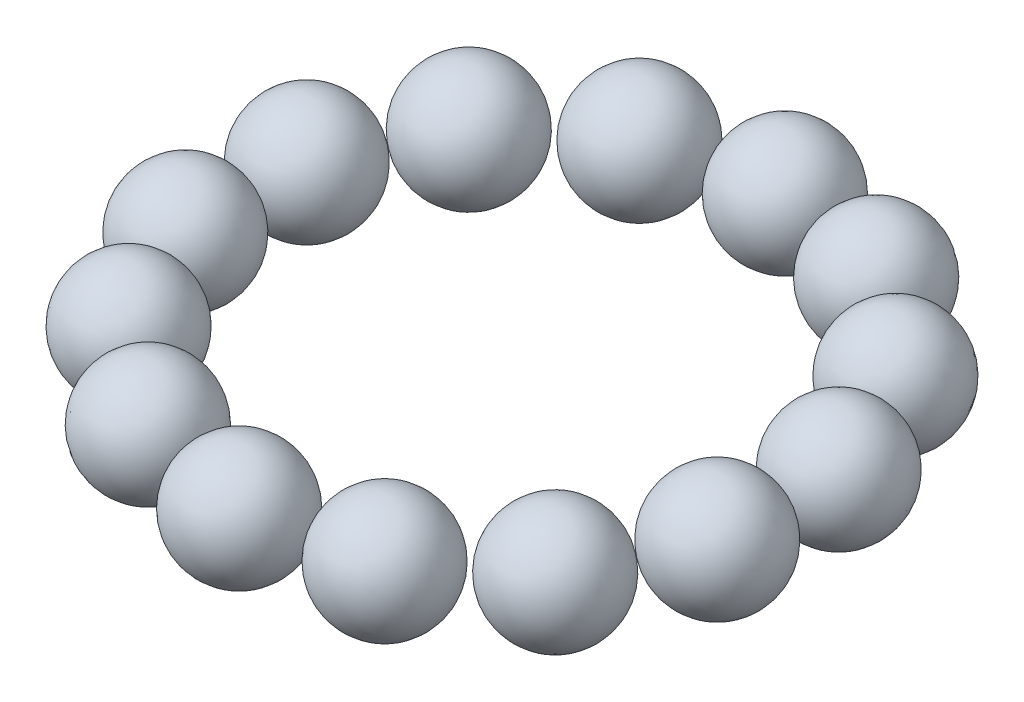
ISO-10303-21;
HEADER;
FILE_DESCRIPTION(('STEP AP214'),'2;1');
FILE_NAME('part.step','',(''),(''),'','','');
FILE_SCHEMA(('AUTOMOTIVE_DESIGN { 1 0 10303 214 1 1 1 1 }'));
ENDSEC;
DATA;
#1=APPLICATION_CONTEXT('core data for automotive mechanical design processes');
#2=APPLICATION_PROTOCOL_DEFINITION('international standard','automotive_design',2000,#1);
#3=PRODUCT_CONTEXT('',#1,'mechanical');
#4=PRODUCT('Part','Part','',(#3));
#5=PRODUCT_RELATED_PRODUCT_CATEGORY('part','',(#4));
#6=PRODUCT_DEFINITION_FORMATION('','',#4);
#7=PRODUCT_DEFINITION_CONTEXT('part definition',#1,'design');
#8=PRODUCT_DEFINITION('design','',#6,#7);
#9=PRODUCT_DEFINITION_SHAPE('','',#8);
#10=(LENGTH_UNIT() NAMED_UNIT(*) SI_UNIT(.MILLI.,.METRE.));
#11=(NAMED_UNIT(*) PLANE_ANGLE_UNIT() SI_UNIT($,.RADIAN.));
#12=(NAMED_UNIT(*) SI_UNIT($,.STERADIAN.) SOLID_ANGLE_UNIT());
#13=UNCERTAINTY_MEASURE_WITH_UNIT(LENGTH_MEASURE(1.E-05),#10,'distance_accuracy_value','');
#14=(GEOMETRIC_REPRESENTATION_CONTEXT(3) GLOBAL_UNCERTAINTY_ASSIGNED_CONTEXT((#13)) GLOBAL_UNIT_ASSIGNED_CONTEXT((#10,
#11,#12)) REPRESENTATION_CONTEXT('',''));
#15=CARTESIAN_POINT('',(0.,0.,0.));
#16=DIRECTION('',(0.,0.,1.));
#17=DIRECTION('',(1.,0.,0.));
#18=AXIS2_PLACEMENT_3D('',#15,#16,#17);
#19=CARTESIAN_POINT('',(-6.07437234764565,0.,12.6135641506339));
#20=DIRECTION('',(0.,-1.,0.));
#21=DIRECTION('',(-0.433883739117546,0.,0.900968867902425));
#22=AXIS2_PLACEMENT_3D('',#19,#20,#21);
#23=SPHERICAL_SURFACE('',#22,3.);
#24=CARTESIAN_POINT('',(-6.07437234764565,-3.,12.6135641506339));
#25=VERTEX_POINT('',#24);
#26=VERTEX_LOOP('',#25);
#27=FACE_BOUND('',#26,.T.);
#28=ADVANCED_FACE('F48',(#27),#23,.T.);
#29=CLOSED_SHELL('',(#28));
#30=MANIFOLD_SOLID_BREP('B2',#29);
#31=CARTESIAN_POINT('',(-10.9456407545523,0.,8.7288572260224));
#32=DIRECTION('',(0.,-1.,0.));
#33=DIRECTION('',(-0.781831482468022,0.,0.623489801858743));
#34=AXIS2_PLACEMENT_3D('',#31,#32,#33);
#35=SPHERICAL_SURFACE('',#34,3.);
#36=CARTESIAN_POINT('',(-10.9456407545523,-3.,8.7288572260224));
#37=VERTEX_POINT('',#36);
#38=VERTEX_LOOP('',#37);
#39=FACE_BOUND('',#38,.T.);
#40=ADVANCED_FACE('F69',(#39),#35,.T.);
#41=CLOSED_SHELL('',(#40));
#42=MANIFOLD_SOLID_BREP('B6',#41);
#43=CARTESIAN_POINT('',(-13.6489907705455,0.,3.11529307538854));
#44=DIRECTION('',(0.,-1.,0.));
#45=DIRECTION('',(-0.974927912181821,0.,0.222520933956325));
#46=AXIS2_PLACEMENT_3D('',#43,#44,#45);
#47=SPHERICAL_SURFACE('',#46,3.);
#48=CARTESIAN_POINT('',(-13.6489907705455,-3.,3.11529307538854));
#49=VERTEX_POINT('',#48);
#50=VERTEX_LOOP('',#49);
#51=FACE_BOUND('',#50,.T.);
#52=ADVANCED_FACE('F88',(#51),#47,.T.);
#53=CLOSED_SHELL('',(#52));
#54=MANIFOLD_SOLID_BREP('B42',#53);
#55=CARTESIAN_POINT('',(-13.6489907705456,0.,-3.11529307538827));
#56=DIRECTION('',(0.,-1.,0.));
#57=DIRECTION('',(-0.974927912181826,0.,-0.222520933956305));
#58=AXIS2_PLACEMENT_3D('',#55,#56,#57);
#59=SPHERICAL_SURFACE('',#58,3.);
#60=CARTESIAN_POINT('',(-13.6489907705456,-3.,-3.11529307538827));
#61=VERTEX_POINT('',#60);
#62=VERTEX_LOOP('',#61);
#63=FACE_BOUND('',#62,.T.);
#64=ADVANCED_FACE('F104',(#63),#59,.T.);
#65=CLOSED_SHELL('',(#64));
#66=MANIFOLD_SOLID_BREP('B64',#65);
#67=CARTESIAN_POINT('',(-10.9456407545525,0.,-8.72885722602217));
#68=DIRECTION('',(0.,-1.,0.));
#69=DIRECTION('',(-0.781831482468035,0.,-0.623489801858727));
#70=AXIS2_PLACEMENT_3D('',#67,#68,#69);
#71=SPHERICAL_SURFACE('',#70,3.);
#72=CARTESIAN_POINT('',(-10.9456407545525,-3.,-8.72885722602217));
#73=VERTEX_POINT('',#72);
#74=VERTEX_LOOP('',#73);
#75=FACE_BOUND('',#74,.T.);
#76=ADVANCED_FACE('F125',(#75),#71,.T.);
#77=CLOSED_SHELL('',(#76));
#78=MANIFOLD_SOLID_BREP('B85',#77);
#79=CARTESIAN_POINT('',(-6.07437234764591,0.,-12.6135641506338));
#80=DIRECTION('',(0.,-1.,0.));
#81=DIRECTION('',(-0.433883739117565,0.,-0.900968867902416));
#82=AXIS2_PLACEMENT_3D('',#79,#80,#81);
#83=SPHERICAL_SURFACE('',#82,3.);
#84=CARTESIAN_POINT('',(-6.07437234764591,-3.,-12.6135641506338));
#85=VERTEX_POINT('',#84);
#86=VERTEX_LOOP('',#85);
#87=FACE_BOUND('',#86,.T.);
#88=ADVANCED_FACE('F141',(#87),#83,.T.);
#89=CLOSED_SHELL('',(#88));
#90=MANIFOLD_SOLID_BREP('B101',#89);
#91=CARTESIAN_POINT('',(0.,0.,-14.));
#92=DIRECTION('',(0.,-1.,0.));
#93=DIRECTION('',(0.,0.,-1.));
#94=AXIS2_PLACEMENT_3D('',#91,#92,#93);
#95=SPHERICAL_SURFACE('',#94,3.);
#96=CARTESIAN_POINT('',(0.,-3.,-14.));
#97=VERTEX_POINT('',#96);
#98=VERTEX_LOOP('',#97);
#99=FACE_BOUND('',#98,.T.);
#100=ADVANCED_FACE('F165',(#99),#95,.T.);
#101=CLOSED_SHELL('',(#100));
#102=MANIFOLD_SOLID_BREP('B120',#101);
#103=CARTESIAN_POINT('',(6.07437234764574,0.,-12.6135641506339));
#104=DIRECTION('',(0.,-1.,0.));
#105=DIRECTION('',(0.433883739117553,0.,-0.900968867902422));
#106=AXIS2_PLACEMENT_3D('',#103,#104,#105);
#107=SPHERICAL_SURFACE('',#106,3.);
#108=CARTESIAN_POINT('',(6.07437234764574,-3.,-12.6135641506339));
#109=VERTEX_POINT('',#108);
#110=VERTEX_LOOP('',#109);
#111=FACE_BOUND('',#110,.T.);
#112=ADVANCED_FACE('F182',(#111),#107,.T.);
#113=CLOSED_SHELL('',(#112));
#114=MANIFOLD_SOLID_BREP('B138',#113);
#115=CARTESIAN_POINT('',(10.9456407545524,0.,-8.72885722602232));
#116=DIRECTION('',(0.,-1.,0.));
#117=DIRECTION('',(0.781831482468027,0.,-0.623489801858737));
#118=AXIS2_PLACEMENT_3D('',#115,#116,#117);
#119=SPHERICAL_SURFACE('',#118,3.);
#120=CARTESIAN_POINT('',(10.9456407545524,-3.,-8.72885722602232));
#121=VERTEX_POINT('',#120);
#122=VERTEX_LOOP('',#121);
#123=FACE_BOUND('',#122,.T.);
#124=ADVANCED_FACE('F199',(#123),#119,.T.);
#125=CLOSED_SHELL('',(#124));
#126=MANIFOLD_SOLID_BREP('B158',#125);
#127=CARTESIAN_POINT('',(13.6489907705455,0.,-3.11529307538846));
#128=DIRECTION('',(0.,-1.,0.));
#129=DIRECTION('',(0.974927912181823,0.,-0.222520933956318));
#130=AXIS2_PLACEMENT_3D('',#127,#128,#129);
#131=SPHERICAL_SURFACE('',#130,3.);
#132=CARTESIAN_POINT('',(13.6489907705455,-3.,-3.11529307538846));
#133=VERTEX_POINT('',#132);
#134=VERTEX_LOOP('',#133);
#135=FACE_BOUND('',#134,.T.);
#136=ADVANCED_FACE('F218',(#135),#131,.T.);
#137=CLOSED_SHELL('',(#136));
#138=MANIFOLD_SOLID_BREP('B179',#137);
#139=CARTESIAN_POINT('',(13.6489907705455,0.,3.11529307538836));
#140=DIRECTION('',(0.,-1.,0.));
#141=DIRECTION('',(0.974927912181824,0.,0.222520933956311));
#142=AXIS2_PLACEMENT_3D('',#139,#140,#141);
#143=SPHERICAL_SURFACE('',#142,3.);
#144=CARTESIAN_POINT('',(13.6489907705455,-3.,3.11529307538836));
#145=VERTEX_POINT('',#144);
#146=VERTEX_LOOP('',#145);
#147=FACE_BOUND('',#146,.T.);
#148=ADVANCED_FACE('F236',(#147),#143,.T.);
#149=CLOSED_SHELL('',(#148));
#150=MANIFOLD_SOLID_BREP('B198',#149);
#151=CARTESIAN_POINT('',(10.9456407545524,0.,8.72885722602225));
#152=DIRECTION('',(0.,-1.,0.));
#153=DIRECTION('',(0.781831482468031,0.,0.623489801858732));
#154=AXIS2_PLACEMENT_3D('',#151,#152,#153);
#155=SPHERICAL_SURFACE('',#154,3.);
#156=CARTESIAN_POINT('',(10.9456407545524,-3.,8.72885722602225));
#157=VERTEX_POINT('',#156);
#158=VERTEX_LOOP('',#157);
#159=FACE_BOUND('',#158,.T.);
#160=ADVANCED_FACE('F260',(#159),#155,.T.);
#161=CLOSED_SHELL('',(#160));
#162=MANIFOLD_SOLID_BREP('B214',#161);
#163=CARTESIAN_POINT('',(6.07437234764583,0.,12.6135641506339));
#164=DIRECTION('',(0.,-1.,0.));
#165=DIRECTION('',(0.433883739117559,0.,0.900968867902419));
#166=AXIS2_PLACEMENT_3D('',#163,#164,#165);
#167=SPHERICAL_SURFACE('',#166,3.);
#168=CARTESIAN_POINT('',(6.07437234764583,-3.,12.6135641506339));
#169=VERTEX_POINT('',#168);
#170=VERTEX_LOOP('',#169);
#171=FACE_BOUND('',#170,.T.);
#172=ADVANCED_FACE('F274',(#171),#167,.T.);
#173=CLOSED_SHELL('',(#172));
#174=MANIFOLD_SOLID_BREP('B235',#173);
#175=CARTESIAN_POINT('',(0.,0.,14.));
#176=DIRECTION('',(0.,-1.,0.));
#177=DIRECTION('',(0.,0.,1.));
#178=AXIS2_PLACEMENT_3D('',#175,#176,#177);
#179=SPHERICAL_SURFACE('',#178,3.);
#180=CARTESIAN_POINT('',(0.,-3.,14.));
#181=VERTEX_POINT('',#180);
#182=VERTEX_LOOP('',#181);
#183=FACE_BOUND('',#182,.T.);
#184=ADVANCED_FACE('F287',(#183),#179,.T.);
#185=CLOSED_SHELL('',(#184));
#186=MANIFOLD_SOLID_BREP('B251',#185);
#187=ADVANCED_BREP_SHAPE_REPRESENTATION('',(#18,#30,#42,#54,#66,#78,#90,#102,#114,#126,#138,
#150,#162,#174,#186),#14);
#188=SHAPE_DEFINITION_REPRESENTATION(#9,#187);
ENDSEC;
END-ISO-10303-21;
